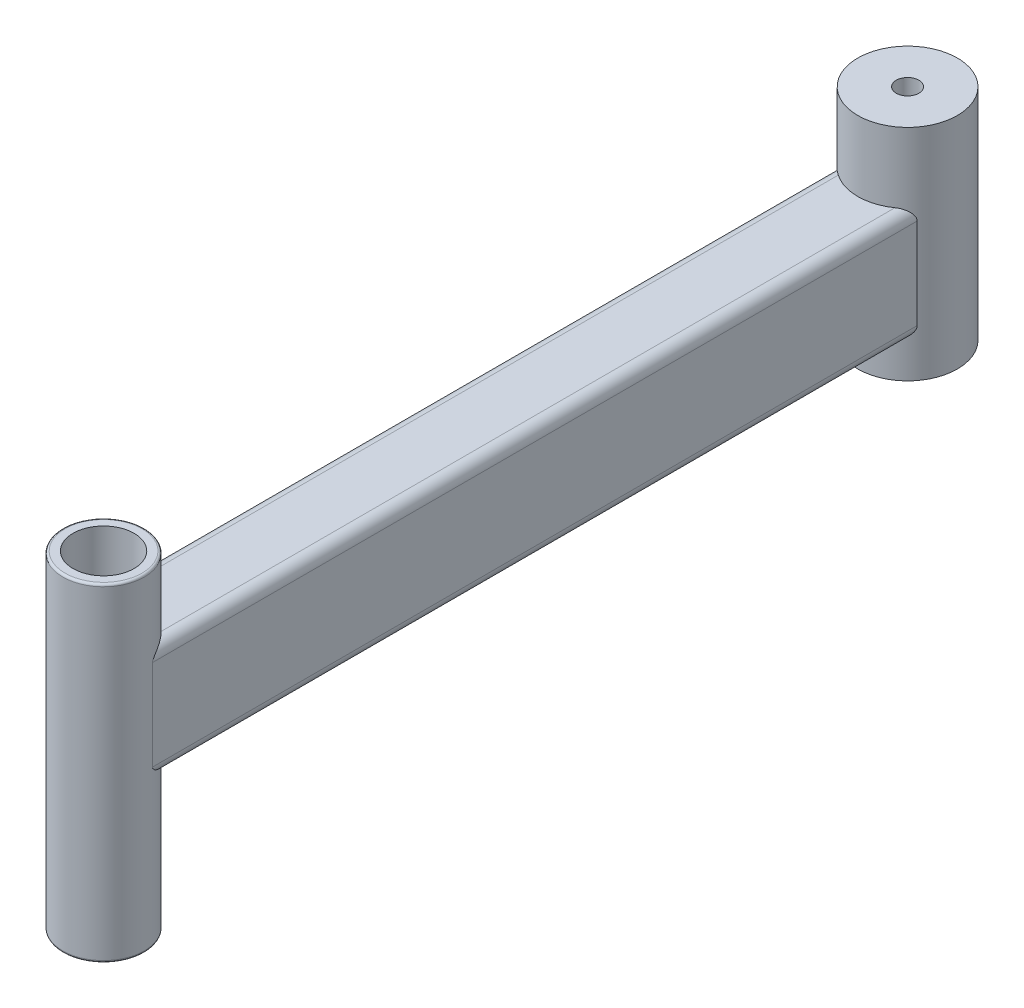
ISO-10303-21;
HEADER;
FILE_DESCRIPTION(('STEP AP214'),'2;1');
FILE_NAME('part.step','',(''),(''),'','','');
FILE_SCHEMA(('AUTOMOTIVE_DESIGN { 1 0 10303 214 1 1 1 1 }'));
ENDSEC;
DATA;
#1=APPLICATION_CONTEXT('core data for automotive mechanical design processes');
#2=APPLICATION_PROTOCOL_DEFINITION('international standard','automotive_design',2000,#1);
#3=PRODUCT_CONTEXT('',#1,'mechanical');
#4=PRODUCT('Part','Part','',(#3));
#5=PRODUCT_RELATED_PRODUCT_CATEGORY('part','',(#4));
#6=PRODUCT_DEFINITION_FORMATION('','',#4);
#7=PRODUCT_DEFINITION_CONTEXT('part definition',#1,'design');
#8=PRODUCT_DEFINITION('design','',#6,#7);
#9=PRODUCT_DEFINITION_SHAPE('','',#8);
#10=(LENGTH_UNIT() NAMED_UNIT(*) SI_UNIT(.MILLI.,.METRE.));
#11=(NAMED_UNIT(*) PLANE_ANGLE_UNIT() SI_UNIT($,.RADIAN.));
#12=(NAMED_UNIT(*) SI_UNIT($,.STERADIAN.) SOLID_ANGLE_UNIT());
#13=UNCERTAINTY_MEASURE_WITH_UNIT(LENGTH_MEASURE(1.E-05),#10,'distance_accuracy_value','');
#14=(GEOMETRIC_REPRESENTATION_CONTEXT(3) GLOBAL_UNCERTAINTY_ASSIGNED_CONTEXT((#13)) GLOBAL_UNIT_ASSIGNED_CONTEXT((#10,
#11,#12)) REPRESENTATION_CONTEXT('',''));
#15=CARTESIAN_POINT('',(0.,0.,0.));
#16=DIRECTION('',(0.,0.,1.));
#17=DIRECTION('',(1.,0.,0.));
#18=AXIS2_PLACEMENT_3D('',#15,#16,#17);
#19=CARTESIAN_POINT('',(0.,-145.,355.176041906346));
#20=DIRECTION('',(0.,1.,0.));
#21=DIRECTION('',(0.,0.,1.));
#22=AXIS2_PLACEMENT_3D('',#19,#20,#21);
#23=CYLINDRICAL_SURFACE('',#22,18.);
#24=CARTESIAN_POINT('',(0.,-144.,355.176041906346));
#25=DIRECTION('',(0.,1.,0.));
#26=DIRECTION('',(0.,0.,1.));
#27=AXIS2_PLACEMENT_3D('',#24,#25,#26);
#28=CIRCLE('',#27,18.);
#29=CARTESIAN_POINT('',(0.,-144.,373.176041906346));
#30=VERTEX_POINT('',#29);
#31=EDGE_CURVE('E55',#30,#30,#28,.T.);
#32=ORIENTED_EDGE('',*,*,#31,.T.);
#33=EDGE_LOOP('',(#32));
#34=FACE_BOUND('',#33,.T.);
#35=CARTESIAN_POINT('',(0.,-1.,355.176041906346));
#36=DIRECTION('',(0.,1.,0.));
#37=DIRECTION('',(0.,0.,1.));
#38=AXIS2_PLACEMENT_3D('',#35,#36,#37);
#39=CIRCLE('',#38,18.);
#40=CARTESIAN_POINT('',(0.,-1.,373.176041906346));
#41=VERTEX_POINT('',#40);
#42=EDGE_CURVE('E59',#41,#41,#39,.F.);
#43=ORIENTED_EDGE('',*,*,#42,.T.);
#44=EDGE_LOOP('',(#43));
#45=FACE_BOUND('',#44,.T.);
#46=ADVANCED_FACE('F44',(#34,#45),#23,.T.);
#47=CARTESIAN_POINT('',(0.,-145.,355.176041906346));
#48=DIRECTION('',(0.,1.,0.));
#49=DIRECTION('',(0.,0.,1.));
#50=AXIS2_PLACEMENT_3D('',#47,#48,#49);
#51=PLANE('',#50);
#52=CARTESIAN_POINT('',(0.,-145.,355.176041906346));
#53=DIRECTION('',(0.,1.,0.));
#54=DIRECTION('',(0.,0.,1.));
#55=AXIS2_PLACEMENT_3D('',#52,#53,#54);
#56=CIRCLE('',#55,17.);
#57=CARTESIAN_POINT('',(0.,-145.,372.176041906346));
#58=VERTEX_POINT('',#57);
#59=EDGE_CURVE('E51',#58,#58,#56,.F.);
#60=ORIENTED_EDGE('',*,*,#59,.T.);
#61=EDGE_LOOP('',(#60));
#62=FACE_BOUND('',#61,.T.);
#63=CARTESIAN_POINT('',(0.,-145.,355.176041906346));
#64=DIRECTION('',(0.,1.,0.));
#65=DIRECTION('',(0.,0.,1.));
#66=AXIS2_PLACEMENT_3D('',#63,#64,#65);
#67=CIRCLE('',#66,13.5);
#68=CARTESIAN_POINT('',(0.,-145.,368.676041906346));
#69=VERTEX_POINT('',#68);
#70=EDGE_CURVE('E64',#69,#69,#67,.T.);
#71=ORIENTED_EDGE('',*,*,#70,.T.);
#72=EDGE_LOOP('',(#71));
#73=FACE_BOUND('',#72,.T.);
#74=ADVANCED_FACE('F71',(#62,#73),#51,.F.);
#75=CARTESIAN_POINT('',(0.,0.,355.176041906346));
#76=DIRECTION('',(0.,1.,0.));
#77=DIRECTION('',(0.,0.,1.));
#78=AXIS2_PLACEMENT_3D('',#75,#76,#77);
#79=PLANE('',#78);
#80=CARTESIAN_POINT('',(0.,0.,355.176041906346));
#81=DIRECTION('',(0.,1.,0.));
#82=DIRECTION('',(0.,0.,1.));
#83=AXIS2_PLACEMENT_3D('',#80,#81,#82);
#84=CIRCLE('',#83,17.);
#85=CARTESIAN_POINT('',(0.,0.,372.176041906346));
#86=VERTEX_POINT('',#85);
#87=EDGE_CURVE('E11',#86,#86,#84,.T.);
#88=ORIENTED_EDGE('',*,*,#87,.T.);
#89=EDGE_LOOP('',(#88));
#90=FACE_BOUND('',#89,.T.);
#91=CARTESIAN_POINT('',(0.,0.,355.176041906346));
#92=DIRECTION('',(0.,1.,0.));
#93=DIRECTION('',(0.,0.,1.));
#94=AXIS2_PLACEMENT_3D('',#91,#92,#93);
#95=CIRCLE('',#94,13.5);
#96=CARTESIAN_POINT('',(0.,0.,368.676041906346));
#97=VERTEX_POINT('',#96);
#98=EDGE_CURVE('E65',#97,#97,#95,.T.);
#99=ORIENTED_EDGE('',*,*,#98,.F.);
#100=EDGE_LOOP('',(#99));
#101=FACE_BOUND('',#100,.T.);
#102=ADVANCED_FACE('F77',(#90,#101),#79,.T.);
#103=CARTESIAN_POINT('',(0.,-145.,355.176041906346));
#104=DIRECTION('',(0.,1.,0.));
#105=DIRECTION('',(0.,0.,1.));
#106=AXIS2_PLACEMENT_3D('',#103,#104,#105);
#107=CYLINDRICAL_SURFACE('',#106,13.5);
#108=ORIENTED_EDGE('',*,*,#70,.F.);
#109=EDGE_LOOP('',(#108));
#110=FACE_BOUND('',#109,.T.);
#111=ORIENTED_EDGE('',*,*,#98,.T.);
#112=EDGE_LOOP('',(#111));
#113=FACE_BOUND('',#112,.T.);
#114=ADVANCED_FACE('F73',(#110,#113),#107,.F.);
#115=CARTESIAN_POINT('',(0.,-144.,355.176041906346));
#116=DIRECTION('',(0.,1.,0.));
#117=DIRECTION('',(0.,0.,1.));
#118=AXIS2_PLACEMENT_3D('',#115,#116,#117);
#119=TOROIDAL_SURFACE('',#118,17.,1.);
#120=ORIENTED_EDGE('',*,*,#59,.F.);
#121=EDGE_LOOP('',(#120));
#122=FACE_BOUND('',#121,.T.);
#123=ORIENTED_EDGE('',*,*,#31,.F.);
#124=EDGE_LOOP('',(#123));
#125=FACE_BOUND('',#124,.T.);
#126=ADVANCED_FACE('F76',(#122,#125),#119,.T.);
#127=CARTESIAN_POINT('',(0.,-1.,355.176041906346));
#128=DIRECTION('',(0.,1.,0.));
#129=DIRECTION('',(0.,0.,1.));
#130=AXIS2_PLACEMENT_3D('',#127,#128,#129);
#131=TOROIDAL_SURFACE('',#130,17.,1.);
#132=ORIENTED_EDGE('',*,*,#42,.F.);
#133=EDGE_LOOP('',(#132));
#134=FACE_BOUND('',#133,.T.);
#135=ORIENTED_EDGE('',*,*,#87,.F.);
#136=EDGE_LOOP('',(#135));
#137=FACE_BOUND('',#136,.T.);
#138=ADVANCED_FACE('F46',(#134,#137),#131,.T.);
#139=CLOSED_SHELL('',(#46,#74,#102,#114,#126,#138));
#140=MANIFOLD_SOLID_BREP('B2',#139);
#141=CARTESIAN_POINT('',(0.,-97.,0.));
#142=DIRECTION('',(0.,1.,0.));
#143=DIRECTION('',(0.,0.,1.));
#144=AXIS2_PLACEMENT_3D('',#141,#142,#143);
#145=CYLINDRICAL_SURFACE('',#144,354.);
#146=DIRECTION('',(0.,1.,0.));
#147=VECTOR('',#146,1.);
#148=CARTESIAN_POINT('',(17.5,-97.,353.56717890664));
#149=LINE('',#148,#147);
#150=CARTESIAN_POINT('',(17.5,-36.,353.56717890664));
#151=VERTEX_POINT('',#150);
#152=CARTESIAN_POINT('',(17.5,-76.,353.56717890664));
#153=VERTEX_POINT('',#152);
#154=EDGE_CURVE('E244',#151,#153,#149,.F.);
#155=ORIENTED_EDGE('',*,*,#154,.F.);
#156=CARTESIAN_POINT('',(17.5,-36.,353.56717890664));
#157=CARTESIAN_POINT('',(17.5000150647416,-35.8595122688849,353.567177530147));
#158=CARTESIAN_POINT('',(17.4940795456842,-35.719027061953,353.567471923026));
#159=CARTESIAN_POINT('',(17.4704167652271,-35.4390624475994,353.568642271233));
#160=CARTESIAN_POINT('',(17.4526900953272,-35.2995829900793,353.569518197389));
#161=CARTESIAN_POINT('',(17.4055637740498,-35.0226713074506,353.571841176537));
#162=CARTESIAN_POINT('',(17.3761687594073,-34.8852382916126,353.573288002665));
#163=CARTESIAN_POINT('',(17.3059232179096,-34.61334312231,353.576733206472));
#164=CARTESIAN_POINT('',(17.2650728215672,-34.4788809350173,353.578731577866));
#165=CARTESIAN_POINT('',(17.172189236064,-34.2138415058942,353.583254802887));
#166=CARTESIAN_POINT('',(17.1201535353781,-34.0832651440877,353.585779774752));
#167=CARTESIAN_POINT('',(17.0052835768178,-33.8269429867388,353.591322896068));
#168=CARTESIAN_POINT('',(16.9424452888188,-33.7011990155167,353.594341229558));
#169=CARTESIAN_POINT('',(16.7384749105206,-33.3328047226124,353.604075278363));
#170=CARTESIAN_POINT('',(16.5817439756881,-33.0985844334664,353.611477118996));
#171=CARTESIAN_POINT('',(16.2311192063511,-32.6596875265278,353.627744085246));
#172=CARTESIAN_POINT('',(16.0372045873971,-32.4550275446746,353.636610028862));
#173=CARTESIAN_POINT('',(15.7228342629522,-32.1746686789475,353.650680121018));
#174=CARTESIAN_POINT('',(15.6140288592515,-32.0855921474136,353.655502953559));
#175=CARTESIAN_POINT('',(15.3893265585896,-31.9169255147087,353.665352071123));
#176=CARTESIAN_POINT('',(15.2734320362899,-31.8373322629485,353.670378287831));
#177=CARTESIAN_POINT('',(15.0225157172517,-31.6801464373086,353.681129601343));
#178=CARTESIAN_POINT('',(14.8867789280421,-31.6036949215522,353.686871619632));
#179=CARTESIAN_POINT('',(14.6087573258985,-31.4637716309417,353.69846420597));
#180=CARTESIAN_POINT('',(14.4664716717237,-31.4003015293603,353.704314787905));
#181=CARTESIAN_POINT('',(14.1763909194352,-31.286828228562,353.716059829899));
#182=CARTESIAN_POINT('',(14.0285881283007,-31.2368446991274,353.721954341298));
#183=CARTESIAN_POINT('',(13.7289698668668,-31.1508780525017,353.733710682413));
#184=CARTESIAN_POINT('',(13.5771545204372,-31.1148945036606,353.73957251313));
#185=CARTESIAN_POINT('',(13.4239792267503,-31.0861153464358,353.745384113659));
#186=B_SPLINE_CURVE_WITH_KNOTS('',3,(#156,#157,#158,#159,#160,#161,#162,#163,#164,#165,#166,
#167,#168,#169,#170,#171,#172,#173,#174,#175,#176,#177,#178,#179,#180,#181,#182,#183,#184,#185),
.UNSPECIFIED.,.F.,.F.,(4,2,2,2,2,2,2,2,2,2,2,2,2,2,4),(0.,0.421333815555317,0.842646496610867,
1.26379192491492,1.68493255524371,2.10616784658078,2.52756063069695,3.36906635436879,
4.21104383034043,4.63272476248174,5.05426520842366,5.52125749475896,5.98830993738756,
6.45603992520483,6.92375549074531),.UNSPECIFIED.);
#187=CARTESIAN_POINT('',(13.4239792267503,-31.0861153464358,353.745384113659));
#188=VERTEX_POINT('',#187);
#189=EDGE_CURVE('E42',#151,#188,#186,.T.);
#190=ORIENTED_EDGE('',*,*,#189,.T.);
#191=DIRECTION('',(0.,1.,0.));
#192=VECTOR('',#191,1.);
#193=CARTESIAN_POINT('',(13.4239792267503,-72.5,353.745384113659));
#194=LINE('',#193,#192);
#195=CARTESIAN_POINT('',(13.4239792267503,-80.9138846535642,353.745384113659));
#196=VERTEX_POINT('',#195);
#197=EDGE_CURVE('E251',#196,#188,#194,.T.);
#198=ORIENTED_EDGE('',*,*,#197,.F.);
#199=CARTESIAN_POINT('',(13.4239792267503,-80.9138846535642,353.745384113659));
#200=CARTESIAN_POINT('',(13.5622448105588,-80.8879011262021,353.740137939004));
#201=CARTESIAN_POINT('',(13.6994038018701,-80.8560541415393,353.734851102303));
#202=CARTESIAN_POINT('',(13.9705456604678,-80.7809251503498,353.724245875584));
#203=CARTESIAN_POINT('',(14.1045286747848,-80.7376436743094,353.71892748704));
#204=CARTESIAN_POINT('',(14.3683248410708,-80.6399513507016,353.708310194541));
#205=CARTESIAN_POINT('',(14.4981393628623,-80.5855442033929,353.703011284704));
#206=CARTESIAN_POINT('',(14.7527207854878,-80.465985391055,353.692484304986));
#207=CARTESIAN_POINT('',(14.8774877469497,-80.400833855128,353.687256234256));
#208=CARTESIAN_POINT('',(15.1211264358502,-80.2602201366558,353.676923765772));
#209=CARTESIAN_POINT('',(15.239996723478,-80.1847554526404,353.671819398379));
#210=CARTESIAN_POINT('',(15.4709777639643,-80.024067265977,353.661790750362));
#211=CARTESIAN_POINT('',(15.5830859724721,-79.9388401245714,353.656866537796));
#212=CARTESIAN_POINT('',(15.9078343101979,-79.6695447424325,353.642457319038));
#213=CARTESIAN_POINT('',(16.1092766928675,-79.4716435601888,353.633319550023));
#214=CARTESIAN_POINT('',(16.4759510296092,-79.044821770797,353.616426249946));
#215=CARTESIAN_POINT('',(16.6411969743694,-78.8159132042229,353.608670185045));
#216=CARTESIAN_POINT('',(16.8584634340692,-78.45431773029,353.598356115957));
#217=CARTESIAN_POINT('',(16.9258272935594,-78.3306395847124,353.595136026434));
#218=CARTESIAN_POINT('',(17.0498871219571,-78.0780507819592,353.589175755122));
#219=CARTESIAN_POINT('',(17.1065866876546,-77.9491419068709,353.58643541155));
#220=CARTESIAN_POINT('',(17.2140799694899,-77.6737541248984,353.581219298932));
#221=CARTESIAN_POINT('',(17.2636996415416,-77.5268152351301,353.578798166617));
#222=CARTESIAN_POINT('',(17.3490941796084,-77.2289414582683,353.57461835904));
#223=CARTESIAN_POINT('',(17.384867377981,-77.0780060921844,353.572859763573));
#224=CARTESIAN_POINT('',(17.4422842721889,-76.7732341539829,353.5700320964));
#225=CARTESIAN_POINT('',(17.4639070637159,-76.6193936334734,353.568964044858));
#226=CARTESIAN_POINT('',(17.4927761113495,-76.3103698574379,353.567536428363));
#227=CARTESIAN_POINT('',(17.5000226445089,-76.1551866278459,353.567176849756));
#228=CARTESIAN_POINT('',(17.5,-76.,353.56717890664));
#229=B_SPLINE_CURVE_WITH_KNOTS('',3,(#199,#200,#201,#202,#203,#204,#205,#206,#207,#208,#209,
#210,#211,#212,#213,#214,#215,#216,#217,#218,#219,#220,#221,#222,#223,#224,#225,#226,#227,#228),
.UNSPECIFIED.,.F.,.F.,(4,2,2,2,2,2,2,2,2,2,2,2,2,2,4),(0.,0.422221545968484,0.844423507030667,
1.2664852767316,1.68854197540075,2.11070122687264,2.53301834480092,3.37635645697449,
4.21936802369179,4.6415580738682,5.0636054739225,5.52825926010098,5.99296899088226,
6.45836369394406,6.9237494280415),.UNSPECIFIED.);
#230=EDGE_CURVE('E156',#196,#153,#229,.T.);
#231=ORIENTED_EDGE('',*,*,#230,.T.);
#232=EDGE_LOOP('',(#155,#190,#198,#231));
#233=FACE_BOUND('',#232,.T.);
#234=ADVANCED_FACE('F143',(#233),#145,.T.);
#235=CARTESIAN_POINT('',(-17.5,-31.,12.));
#236=DIRECTION('',(0.,-1.,0.));
#237=DIRECTION('',(1.,0.,0.));
#238=AXIS2_PLACEMENT_3D('',#235,#236,#237);
#239=PLANE('',#238);
#240=DIRECTION('',(1.,0.,0.));
#241=VECTOR('',#240,1.);
#242=CARTESIAN_POINT('',(-17.5,-31.,12.));
#243=LINE('',#242,#241);
#244=CARTESIAN_POINT('',(-12.5,-31.,12.));
#245=VERTEX_POINT('',#244);
#246=CARTESIAN_POINT('',(12.5,-31.,12.));
#247=VERTEX_POINT('',#246);
#248=EDGE_CURVE('E346',#245,#247,#243,.T.);
#249=ORIENTED_EDGE('',*,*,#248,.F.);
#250=DIRECTION('',(0.,0.,1.));
#251=VECTOR('',#250,1.);
#252=CARTESIAN_POINT('',(-12.5,-31.,353.56717890664));
#253=LINE('',#252,#251);
#254=CARTESIAN_POINT('',(-12.5,-31.,350.077022392753));
#255=VERTEX_POINT('',#254);
#256=EDGE_CURVE('E330',#245,#255,#253,.T.);
#257=ORIENTED_EDGE('',*,*,#256,.T.);
#258=CARTESIAN_POINT('',(0.,-31.,355.176041906346));
#259=DIRECTION('',(0.,-1.,0.));
#260=DIRECTION('',(1.,0.,0.));
#261=AXIS2_PLACEMENT_3D('',#258,#259,#260);
#262=CIRCLE('',#261,13.5);
#263=CARTESIAN_POINT('',(12.5,-31.,350.077022392753));
#264=VERTEX_POINT('',#263);
#265=EDGE_CURVE('E245',#255,#264,#262,.T.);
#266=ORIENTED_EDGE('',*,*,#265,.T.);
#267=DIRECTION('',(0.,0.,1.));
#268=VECTOR('',#267,1.);
#269=CARTESIAN_POINT('',(12.5,-31.,12.));
#270=LINE('',#269,#268);
#271=EDGE_CURVE('E328',#264,#247,#270,.F.);
#272=ORIENTED_EDGE('',*,*,#271,.T.);
#273=EDGE_LOOP('',(#249,#257,#266,#272));
#274=FACE_BOUND('',#273,.T.);
#275=ADVANCED_FACE('F366',(#274),#239,.F.);
#276=CARTESIAN_POINT('',(17.5,-31.,12.));
#277=DIRECTION('',(-1.,0.,0.));
#278=DIRECTION('',(0.,-1.,0.));
#279=AXIS2_PLACEMENT_3D('',#276,#277,#278);
#280=PLANE('',#279);
#281=DIRECTION('',(0.,-1.,0.));
#282=VECTOR('',#281,1.);
#283=CARTESIAN_POINT('',(17.5,-31.,12.));
#284=LINE('',#283,#282);
#285=CARTESIAN_POINT('',(17.5,-36.,12.));
#286=VERTEX_POINT('',#285);
#287=CARTESIAN_POINT('',(17.5,-76.,12.));
#288=VERTEX_POINT('',#287);
#289=EDGE_CURVE('E344',#286,#288,#284,.T.);
#290=ORIENTED_EDGE('',*,*,#289,.F.);
#291=DIRECTION('',(0.,0.,1.));
#292=VECTOR('',#291,1.);
#293=CARTESIAN_POINT('',(17.5,-36.,12.));
#294=LINE('',#293,#292);
#295=EDGE_CURVE('E335',#286,#151,#294,.T.);
#296=ORIENTED_EDGE('',*,*,#295,.T.);
#297=ORIENTED_EDGE('',*,*,#154,.T.);
#298=DIRECTION('',(0.,0.,1.));
#299=VECTOR('',#298,1.);
#300=CARTESIAN_POINT('',(17.5,-76.,12.));
#301=LINE('',#300,#299);
#302=EDGE_CURVE('E333',#153,#288,#301,.F.);
#303=ORIENTED_EDGE('',*,*,#302,.T.);
#304=EDGE_LOOP('',(#290,#296,#297,#303));
#305=FACE_BOUND('',#304,.T.);
#306=ADVANCED_FACE('F341',(#305),#280,.F.);
#307=CARTESIAN_POINT('',(-17.5,-81.,12.));
#308=DIRECTION('',(0.,-1.,0.));
#309=DIRECTION('',(0.,0.,-1.));
#310=AXIS2_PLACEMENT_3D('',#307,#308,#309);
#311=PLANE('',#310);
#312=CARTESIAN_POINT('',(0.,-81.,355.176041906346));
#313=DIRECTION('',(0.,-1.,0.));
#314=DIRECTION('',(0.,0.,-1.));
#315=AXIS2_PLACEMENT_3D('',#312,#313,#314);
#316=CIRCLE('',#315,13.5);
#317=CARTESIAN_POINT('',(-12.5,-81.,350.077022392753));
#318=VERTEX_POINT('',#317);
#319=CARTESIAN_POINT('',(12.5,-81.,350.077022392753));
#320=VERTEX_POINT('',#319);
#321=EDGE_CURVE('E367',#318,#320,#316,.T.);
#322=ORIENTED_EDGE('',*,*,#321,.F.);
#323=DIRECTION('',(0.,0.,1.));
#324=VECTOR('',#323,1.);
#325=CARTESIAN_POINT('',(-12.5,-81.,12.));
#326=LINE('',#325,#324);
#327=CARTESIAN_POINT('',(-12.5,-81.,12.));
#328=VERTEX_POINT('',#327);
#329=EDGE_CURVE('E313',#318,#328,#326,.F.);
#330=ORIENTED_EDGE('',*,*,#329,.T.);
#331=DIRECTION('',(1.,0.,0.));
#332=VECTOR('',#331,1.);
#333=CARTESIAN_POINT('',(-17.5,-81.,12.));
#334=LINE('',#333,#332);
#335=CARTESIAN_POINT('',(12.5,-81.,12.));
#336=VERTEX_POINT('',#335);
#337=EDGE_CURVE('E354',#328,#336,#334,.T.);
#338=ORIENTED_EDGE('',*,*,#337,.T.);
#339=DIRECTION('',(0.,0.,1.));
#340=VECTOR('',#339,1.);
#341=CARTESIAN_POINT('',(12.5,-81.,353.56717890664));
#342=LINE('',#341,#340);
#343=EDGE_CURVE('E314',#336,#320,#342,.T.);
#344=ORIENTED_EDGE('',*,*,#343,.T.);
#345=EDGE_LOOP('',(#322,#330,#338,#344));
#346=FACE_BOUND('',#345,.T.);
#347=ADVANCED_FACE('F360',(#346),#311,.T.);
#348=CARTESIAN_POINT('',(-17.5,-31.,12.));
#349=DIRECTION('',(-1.,0.,0.));
#350=DIRECTION('',(0.,-1.,0.));
#351=AXIS2_PLACEMENT_3D('',#348,#349,#350);
#352=PLANE('',#351);
#353=DIRECTION('',(0.,-1.,0.));
#354=VECTOR('',#353,1.);
#355=CARTESIAN_POINT('',(-17.5,-31.,12.));
#356=LINE('',#355,#354);
#357=CARTESIAN_POINT('',(-17.5,-36.,12.));
#358=VERTEX_POINT('',#357);
#359=CARTESIAN_POINT('',(-17.5,-76.,12.));
#360=VERTEX_POINT('',#359);
#361=EDGE_CURVE('E310',#358,#360,#356,.T.);
#362=ORIENTED_EDGE('',*,*,#361,.T.);
#363=DIRECTION('',(0.,0.,1.));
#364=VECTOR('',#363,1.);
#365=CARTESIAN_POINT('',(-17.5,-76.,12.));
#366=LINE('',#365,#364);
#367=CARTESIAN_POINT('',(-17.5,-76.,353.56717890664));
#368=VERTEX_POINT('',#367);
#369=EDGE_CURVE('E235',#360,#368,#366,.T.);
#370=ORIENTED_EDGE('',*,*,#369,.T.);
#371=DIRECTION('',(0.,1.,0.));
#372=VECTOR('',#371,1.);
#373=CARTESIAN_POINT('',(-17.5,-97.,353.56717890664));
#374=LINE('',#373,#372);
#375=CARTESIAN_POINT('',(-17.5,-36.,353.56717890664));
#376=VERTEX_POINT('',#375);
#377=EDGE_CURVE('E229',#376,#368,#374,.F.);
#378=ORIENTED_EDGE('',*,*,#377,.F.);
#379=DIRECTION('',(0.,0.,1.));
#380=VECTOR('',#379,1.);
#381=CARTESIAN_POINT('',(-17.5,-36.,12.));
#382=LINE('',#381,#380);
#383=EDGE_CURVE('E241',#376,#358,#382,.F.);
#384=ORIENTED_EDGE('',*,*,#383,.T.);
#385=EDGE_LOOP('',(#362,#370,#378,#384));
#386=FACE_BOUND('',#385,.T.);
#387=ADVANCED_FACE('F240',(#386),#352,.T.);
#388=CARTESIAN_POINT('',(0.,0.,12.));
#389=DIRECTION('',(0.,0.,-1.));
#390=DIRECTION('',(-1.,0.,0.));
#391=AXIS2_PLACEMENT_3D('',#388,#389,#390);
#392=PLANE('',#391);
#393=ORIENTED_EDGE('',*,*,#337,.F.);
#394=CARTESIAN_POINT('',(-12.5,-76.,12.));
#395=DIRECTION('',(0.,0.,-1.));
#396=DIRECTION('',(-1.,0.,0.));
#397=AXIS2_PLACEMENT_3D('',#394,#395,#396);
#398=CIRCLE('',#397,5.);
#399=EDGE_CURVE('E326',#328,#360,#398,.T.);
#400=ORIENTED_EDGE('',*,*,#399,.T.);
#401=ORIENTED_EDGE('',*,*,#361,.F.);
#402=CARTESIAN_POINT('',(-12.5,-36.,12.));
#403=DIRECTION('',(0.,0.,-1.));
#404=DIRECTION('',(-1.,0.,0.));
#405=AXIS2_PLACEMENT_3D('',#402,#403,#404);
#406=CIRCLE('',#405,5.);
#407=EDGE_CURVE('E250',#358,#245,#406,.T.);
#408=ORIENTED_EDGE('',*,*,#407,.T.);
#409=ORIENTED_EDGE('',*,*,#248,.T.);
#410=CARTESIAN_POINT('',(12.5,-36.,12.));
#411=DIRECTION('',(0.,0.,-1.));
#412=DIRECTION('',(-1.,0.,0.));
#413=AXIS2_PLACEMENT_3D('',#410,#411,#412);
#414=CIRCLE('',#413,5.);
#415=EDGE_CURVE('E323',#247,#286,#414,.T.);
#416=ORIENTED_EDGE('',*,*,#415,.T.);
#417=ORIENTED_EDGE('',*,*,#289,.T.);
#418=CARTESIAN_POINT('',(12.5,-76.,12.));
#419=DIRECTION('',(0.,0.,-1.));
#420=DIRECTION('',(-1.,0.,0.));
#421=AXIS2_PLACEMENT_3D('',#418,#419,#420);
#422=CIRCLE('',#421,5.);
#423=EDGE_CURVE('E319',#288,#336,#422,.T.);
#424=ORIENTED_EDGE('',*,*,#423,.T.);
#425=EDGE_LOOP('',(#393,#400,#401,#408,#409,#416,#417,#424));
#426=FACE_BOUND('',#425,.T.);
#427=ADVANCED_FACE('F358',(#426),#392,.T.);
#428=ORIENTED_EDGE('',*,*,#377,.T.);
#429=CARTESIAN_POINT('',(-17.5,-76.,353.56717890664));
#430=CARTESIAN_POINT('',(-17.5000150647416,-76.1404877311151,353.567177530147));
#431=CARTESIAN_POINT('',(-17.4940795456842,-76.280972938047,353.567471923026));
#432=CARTESIAN_POINT('',(-17.4704167652271,-76.5609375524006,353.568642271233));
#433=CARTESIAN_POINT('',(-17.4526900953272,-76.7004170099207,353.569518197389));
#434=CARTESIAN_POINT('',(-17.4055637740498,-76.9773286925493,353.571841176537));
#435=CARTESIAN_POINT('',(-17.3761687594073,-77.1147617083874,353.573288002665));
#436=CARTESIAN_POINT('',(-17.3059232179096,-77.38665687769,353.576733206472));
#437=CARTESIAN_POINT('',(-17.2650728215672,-77.5211190649827,353.578731577866));
#438=CARTESIAN_POINT('',(-17.172189236064,-77.7861584941058,353.583254802887));
#439=CARTESIAN_POINT('',(-17.1201535353781,-77.9167348559123,353.585779774752));
#440=CARTESIAN_POINT('',(-17.0052835768178,-78.1730570132612,353.591322896068));
#441=CARTESIAN_POINT('',(-16.9424452888188,-78.2988009844833,353.594341229558));
#442=CARTESIAN_POINT('',(-16.7384749105206,-78.6671952773876,353.604075278363));
#443=CARTESIAN_POINT('',(-16.5817439756881,-78.9014155665336,353.611477118996));
#444=CARTESIAN_POINT('',(-16.2311192063511,-79.3403124734722,353.627744085246));
#445=CARTESIAN_POINT('',(-16.0372045873971,-79.5449724553254,353.636610028862));
#446=CARTESIAN_POINT('',(-15.7228342629522,-79.8253313210525,353.650680121018));
#447=CARTESIAN_POINT('',(-15.6140288592515,-79.9144078525864,353.655502953559));
#448=CARTESIAN_POINT('',(-15.3893265585896,-80.0830744852913,353.665352071123));
#449=CARTESIAN_POINT('',(-15.2734320362899,-80.1626677370515,353.670378287831));
#450=CARTESIAN_POINT('',(-15.0225157172517,-80.3198535626914,353.681129601343));
#451=CARTESIAN_POINT('',(-14.8867789280421,-80.3963050784478,353.686871619632));
#452=CARTESIAN_POINT('',(-14.6087573258985,-80.5362283690583,353.69846420597));
#453=CARTESIAN_POINT('',(-14.4664716717237,-80.5996984706397,353.704314787905));
#454=CARTESIAN_POINT('',(-14.1763909194352,-80.713171771438,353.716059829899));
#455=CARTESIAN_POINT('',(-14.0285881283007,-80.7631553008726,353.721954341298));
#456=CARTESIAN_POINT('',(-13.7289698668668,-80.8491219474983,353.733710682413));
#457=CARTESIAN_POINT('',(-13.5771545204372,-80.8851054963394,353.73957251313));
#458=CARTESIAN_POINT('',(-13.4239792267503,-80.9138846535642,353.745384113659));
#459=B_SPLINE_CURVE_WITH_KNOTS('',3,(#429,#430,#431,#432,#433,#434,#435,#436,#437,#438,#439,
#440,#441,#442,#443,#444,#445,#446,#447,#448,#449,#450,#451,#452,#453,#454,#455,#456,#457,#458),
.UNSPECIFIED.,.F.,.F.,(4,2,2,2,2,2,2,2,2,2,2,2,2,2,4),(0.,0.421333815555331,0.842646496610867,
1.26379192491491,1.68493255524371,2.10616784658077,2.52756063069694,3.3690663543688,
4.21104383034043,4.63272476248174,5.05426520842366,5.52125749475896,5.98830993738756,
6.45603992520482,6.92375549074529),.UNSPECIFIED.);
#460=CARTESIAN_POINT('',(-13.4239792267503,-80.9138846535642,353.745384113659));
#461=VERTEX_POINT('',#460);
#462=EDGE_CURVE('E234',#368,#461,#459,.T.);
#463=ORIENTED_EDGE('',*,*,#462,.T.);
#464=DIRECTION('',(0.,1.,0.));
#465=VECTOR('',#464,1.);
#466=CARTESIAN_POINT('',(-13.4239792267503,-72.5,353.745384113659));
#467=LINE('',#466,#465);
#468=CARTESIAN_POINT('',(-13.4239792267503,-31.0861153464358,353.745384113659));
#469=VERTEX_POINT('',#468);
#470=EDGE_CURVE('E231',#469,#461,#467,.F.);
#471=ORIENTED_EDGE('',*,*,#470,.F.);
#472=CARTESIAN_POINT('',(-13.4239792267503,-31.0861153464358,353.745384113659));
#473=CARTESIAN_POINT('',(-13.5622448105588,-31.1120988737979,353.740137939004));
#474=CARTESIAN_POINT('',(-13.6994038018701,-31.1439458584607,353.734851102303));
#475=CARTESIAN_POINT('',(-13.9705456604678,-31.2190748496502,353.724245875584));
#476=CARTESIAN_POINT('',(-14.1045286747848,-31.2623563256906,353.71892748704));
#477=CARTESIAN_POINT('',(-14.3683248410708,-31.3600486492984,353.708310194541));
#478=CARTESIAN_POINT('',(-14.4981393628623,-31.4144557966071,353.703011284704));
#479=CARTESIAN_POINT('',(-14.7527207854878,-31.534014608945,353.692484304986));
#480=CARTESIAN_POINT('',(-14.8774877469497,-31.599166144872,353.687256234256));
#481=CARTESIAN_POINT('',(-15.1211264358502,-31.7397798633442,353.676923765772));
#482=CARTESIAN_POINT('',(-15.239996723478,-31.8152445473596,353.671819398379));
#483=CARTESIAN_POINT('',(-15.4709777639643,-31.9759327340231,353.661790750362));
#484=CARTESIAN_POINT('',(-15.5830859724721,-32.0611598754286,353.656866537796));
#485=CARTESIAN_POINT('',(-15.9078343101979,-32.3304552575675,353.642457319038));
#486=CARTESIAN_POINT('',(-16.1092766928675,-32.5283564398112,353.633319550023));
#487=CARTESIAN_POINT('',(-16.4759510296092,-32.955178229203,353.616426249946));
#488=CARTESIAN_POINT('',(-16.6411969743694,-33.1840867957771,353.608670185045));
#489=CARTESIAN_POINT('',(-16.8584634340692,-33.54568226971,353.598356115957));
#490=CARTESIAN_POINT('',(-16.9258272935594,-33.6693604152875,353.595136026434));
#491=CARTESIAN_POINT('',(-17.049887121957,-33.9219492180408,353.589175755122));
#492=CARTESIAN_POINT('',(-17.1065866876546,-34.0508580931291,353.58643541155));
#493=CARTESIAN_POINT('',(-17.2140799694899,-34.3262458751016,353.581219298932));
#494=CARTESIAN_POINT('',(-17.2636996415416,-34.4731847648699,353.578798166617));
#495=CARTESIAN_POINT('',(-17.3490941796084,-34.7710585417317,353.57461835904));
#496=CARTESIAN_POINT('',(-17.384867377981,-34.9219939078156,353.572859763573));
#497=CARTESIAN_POINT('',(-17.4422842721889,-35.2267658460172,353.5700320964));
#498=CARTESIAN_POINT('',(-17.4639070637158,-35.3806063665266,353.568964044858));
#499=CARTESIAN_POINT('',(-17.4927761113495,-35.6896301425621,353.567536428363));
#500=CARTESIAN_POINT('',(-17.5000226445089,-35.8448133721541,353.567176849756));
#501=CARTESIAN_POINT('',(-17.5,-36.,353.56717890664));
#502=B_SPLINE_CURVE_WITH_KNOTS('',3,(#472,#473,#474,#475,#476,#477,#478,#479,#480,#481,#482,
#483,#484,#485,#486,#487,#488,#489,#490,#491,#492,#493,#494,#495,#496,#497,#498,#499,#500,#501),
.UNSPECIFIED.,.F.,.F.,(4,2,2,2,2,2,2,2,2,2,2,2,2,2,4),(0.,0.422221545968482,0.84442350703067,
1.2664852767316,1.68854197540075,2.11070122687263,2.53301834480092,3.37635645697449,
4.21936802369176,4.64155807386818,5.06360547392248,5.52825926010097,5.99296899088226,
6.45836369394405,6.9237494280415),.UNSPECIFIED.);
#503=EDGE_CURVE('E226',#469,#376,#502,.T.);
#504=ORIENTED_EDGE('',*,*,#503,.T.);
#505=EDGE_LOOP('',(#428,#463,#471,#504));
#506=FACE_BOUND('',#505,.T.);
#507=ADVANCED_FACE('F228',(#506),#145,.T.);
#508=CARTESIAN_POINT('',(0.,-145.,355.176041906346));
#509=DIRECTION('',(0.,1.,0.));
#510=DIRECTION('',(0.,0.,1.));
#511=AXIS2_PLACEMENT_3D('',#508,#509,#510);
#512=CYLINDRICAL_SURFACE('',#511,13.5);
#513=ORIENTED_EDGE('',*,*,#470,.T.);
#514=CARTESIAN_POINT('',(-13.4239792267503,-80.9138846535642,353.745384113659));
#515=CARTESIAN_POINT('',(-13.4071763038213,-80.9170368281776,353.58771969198));
#516=CARTESIAN_POINT('',(-13.3875976301796,-80.9206372317102,353.430373275264));
#517=CARTESIAN_POINT('',(-13.3429143594401,-80.9284910674924,353.116486657976));
#518=CARTESIAN_POINT('',(-13.3178098799026,-80.9327444858486,352.959946440325));
#519=CARTESIAN_POINT('',(-13.2345281249897,-80.9460740329486,352.493367376093));
#520=CARTESIAN_POINT('',(-13.1682108598333,-80.9557564803299,352.184763406921));
#521=CARTESIAN_POINT('',(-13.0141101218389,-80.9741033926083,351.572923692448));
#522=CARTESIAN_POINT('',(-12.9263264842243,-80.9827678496906,351.269687988372));
#523=CARTESIAN_POINT('',(-12.7786304988714,-80.9924746307987,350.819236745524));
#524=CARTESIAN_POINT('',(-12.726575857086,-80.9951645145901,350.669445757948));
#525=CARTESIAN_POINT('',(-12.6172128729213,-80.9989242036455,350.371764153284));
#526=CARTESIAN_POINT('',(-12.5599042131452,-80.9999939109658,350.22387365162));
#527=CARTESIAN_POINT('',(-12.5,-81.,350.077022392753));
#528=B_SPLINE_CURVE_WITH_KNOTS('',3,(#514,#515,#516,#517,#518,#519,#520,#521,#522,#523,#524,
#525,#526,#527),.UNSPECIFIED.,.F.,.F.,(4,2,2,2,2,2,4),(0.,0.475715031297785,0.95141994285667,
1.89799198352207,2.84457129033658,3.32028033763883,3.79601814162236),.UNSPECIFIED.);
#529=EDGE_CURVE('E285',#461,#318,#528,.T.);
#530=ORIENTED_EDGE('',*,*,#529,.T.);
#531=ORIENTED_EDGE('',*,*,#321,.T.);
#532=CARTESIAN_POINT('',(12.5,-81.,350.077022392753));
#533=CARTESIAN_POINT('',(12.5599042131452,-80.9999939109658,350.22387365162));
#534=CARTESIAN_POINT('',(12.6172128729213,-80.9989242036455,350.371764153284));
#535=CARTESIAN_POINT('',(12.7265758570861,-80.9951645145901,350.669445757948));
#536=CARTESIAN_POINT('',(12.7786304988714,-80.9924746307987,350.819236745524));
#537=CARTESIAN_POINT('',(12.9263264842243,-80.9827678496906,351.269687988372));
#538=CARTESIAN_POINT('',(13.0141101218389,-80.9741033926083,351.572923692448));
#539=CARTESIAN_POINT('',(13.1682108598333,-80.9557564803299,352.184763406921));
#540=CARTESIAN_POINT('',(13.2345281249897,-80.9460740329486,352.493367376093));
#541=CARTESIAN_POINT('',(13.3178098799026,-80.9327444858486,352.959946440325));
#542=CARTESIAN_POINT('',(13.3429143594401,-80.9284910674924,353.116486657976));
#543=CARTESIAN_POINT('',(13.3875976301796,-80.9206372317102,353.430373275264));
#544=CARTESIAN_POINT('',(13.4071763038213,-80.9170368281776,353.58771969198));
#545=CARTESIAN_POINT('',(13.4239792267503,-80.9138846535642,353.745384113659));
#546=B_SPLINE_CURVE_WITH_KNOTS('',3,(#532,#533,#534,#535,#536,#537,#538,#539,#540,#541,#542,
#543,#544,#545),.UNSPECIFIED.,.F.,.F.,(4,2,2,2,2,2,4),(0.,0.475737803983525,0.951446851285829,
1.89802615810029,2.84459819876568,3.32030311032451,3.7960181416223),.UNSPECIFIED.);
#547=EDGE_CURVE('E300',#320,#196,#546,.T.);
#548=ORIENTED_EDGE('',*,*,#547,.T.);
#549=ORIENTED_EDGE('',*,*,#197,.T.);
#550=CARTESIAN_POINT('',(13.4239792267503,-31.0861153464358,353.745384113659));
#551=CARTESIAN_POINT('',(13.4071763038213,-31.0829631718224,353.58771969198));
#552=CARTESIAN_POINT('',(13.3875976301796,-31.0793627682898,353.430373275264));
#553=CARTESIAN_POINT('',(13.3429143594401,-31.0715089325076,353.116486657976));
#554=CARTESIAN_POINT('',(13.3178098799026,-31.0672555141514,352.959946440325));
#555=CARTESIAN_POINT('',(13.2345281249897,-31.0539259670514,352.493367376093));
#556=CARTESIAN_POINT('',(13.1682108598333,-31.0442435196701,352.184763406921));
#557=CARTESIAN_POINT('',(13.0141101218389,-31.0258966073917,351.572923692448));
#558=CARTESIAN_POINT('',(12.9263264842243,-31.0172321503094,351.269687988372));
#559=CARTESIAN_POINT('',(12.7786304988714,-31.0075253692013,350.819236745524));
#560=CARTESIAN_POINT('',(12.7265758570861,-31.0048354854099,350.669445757948));
#561=CARTESIAN_POINT('',(12.6172128729213,-31.0010757963545,350.371764153284));
#562=CARTESIAN_POINT('',(12.5599042131452,-31.0000060890342,350.22387365162));
#563=CARTESIAN_POINT('',(12.5,-31.,350.077022392753));
#564=B_SPLINE_CURVE_WITH_KNOTS('',3,(#550,#551,#552,#553,#554,#555,#556,#557,#558,#559,#560,
#561,#562,#563),.UNSPECIFIED.,.F.,.F.,(4,2,2,2,2,2,4),(0.,0.475715031297785,0.951419942856613,
1.89799198352201,2.84457129033653,3.32028033763883,3.7960181416223),.UNSPECIFIED.);
#565=EDGE_CURVE('E286',#188,#264,#564,.T.);
#566=ORIENTED_EDGE('',*,*,#565,.T.);
#567=ORIENTED_EDGE('',*,*,#265,.F.);
#568=CARTESIAN_POINT('',(-12.5,-31.,350.077022392753));
#569=CARTESIAN_POINT('',(-12.5599042131452,-31.0000060890342,350.22387365162));
#570=CARTESIAN_POINT('',(-12.6172128729213,-31.0010757963545,350.371764153284));
#571=CARTESIAN_POINT('',(-12.7265758570861,-31.0048354854099,350.669445757948));
#572=CARTESIAN_POINT('',(-12.7786304988714,-31.0075253692013,350.819236745524));
#573=CARTESIAN_POINT('',(-12.9263264842243,-31.0172321503094,351.269687988372));
#574=CARTESIAN_POINT('',(-13.0141101218389,-31.0258966073917,351.572923692448));
#575=CARTESIAN_POINT('',(-13.1682108598333,-31.0442435196701,352.184763406921));
#576=CARTESIAN_POINT('',(-13.2345281249897,-31.0539259670514,352.493367376093));
#577=CARTESIAN_POINT('',(-13.3178098799026,-31.0672555141514,352.959946440325));
#578=CARTESIAN_POINT('',(-13.3429143594401,-31.0715089325076,353.116486657976));
#579=CARTESIAN_POINT('',(-13.3875976301796,-31.0793627682898,353.430373275264));
#580=CARTESIAN_POINT('',(-13.4071763038213,-31.0829631718224,353.58771969198));
#581=CARTESIAN_POINT('',(-13.4239792267503,-31.0861153464358,353.745384113659));
#582=B_SPLINE_CURVE_WITH_KNOTS('',3,(#568,#569,#570,#571,#572,#573,#574,#575,#576,#577,#578,
#579,#580,#581),.UNSPECIFIED.,.F.,.F.,(4,2,2,2,2,2,4),(0.,0.475737803983523,0.951446851285827,
1.89802615810034,2.84459819876574,3.32030311032457,3.79601814162235),.UNSPECIFIED.);
#583=EDGE_CURVE('E279',#255,#469,#582,.T.);
#584=ORIENTED_EDGE('',*,*,#583,.T.);
#585=EDGE_LOOP('',(#513,#530,#531,#548,#549,#566,#567,#584));
#586=FACE_BOUND('',#585,.T.);
#587=ADVANCED_FACE('F294',(#586),#512,.F.);
#588=CARTESIAN_POINT('',(-12.5,-76.,12.));
#589=DIRECTION('',(0.,0.,1.));
#590=DIRECTION('',(1.,0.,0.));
#591=AXIS2_PLACEMENT_3D('',#588,#589,#590);
#592=CYLINDRICAL_SURFACE('',#591,5.);
#593=ORIENTED_EDGE('',*,*,#399,.F.);
#594=ORIENTED_EDGE('',*,*,#329,.F.);
#595=ORIENTED_EDGE('',*,*,#529,.F.);
#596=ORIENTED_EDGE('',*,*,#462,.F.);
#597=ORIENTED_EDGE('',*,*,#369,.F.);
#598=EDGE_LOOP('',(#593,#594,#595,#596,#597));
#599=FACE_BOUND('',#598,.T.);
#600=ADVANCED_FACE('F273',(#599),#592,.T.);
#601=CARTESIAN_POINT('',(-12.5,-36.,12.));
#602=DIRECTION('',(0.,0.,-1.));
#603=DIRECTION('',(-1.,0.,0.));
#604=AXIS2_PLACEMENT_3D('',#601,#602,#603);
#605=CYLINDRICAL_SURFACE('',#604,5.);
#606=ORIENTED_EDGE('',*,*,#407,.F.);
#607=ORIENTED_EDGE('',*,*,#383,.F.);
#608=ORIENTED_EDGE('',*,*,#503,.F.);
#609=ORIENTED_EDGE('',*,*,#583,.F.);
#610=ORIENTED_EDGE('',*,*,#256,.F.);
#611=EDGE_LOOP('',(#606,#607,#608,#609,#610));
#612=FACE_BOUND('',#611,.T.);
#613=ADVANCED_FACE('F248',(#612),#605,.T.);
#614=CARTESIAN_POINT('',(12.5,-36.,12.));
#615=DIRECTION('',(0.,0.,1.));
#616=DIRECTION('',(1.,0.,0.));
#617=AXIS2_PLACEMENT_3D('',#614,#615,#616);
#618=CYLINDRICAL_SURFACE('',#617,5.);
#619=ORIENTED_EDGE('',*,*,#415,.F.);
#620=ORIENTED_EDGE('',*,*,#271,.F.);
#621=ORIENTED_EDGE('',*,*,#565,.F.);
#622=ORIENTED_EDGE('',*,*,#189,.F.);
#623=ORIENTED_EDGE('',*,*,#295,.F.);
#624=EDGE_LOOP('',(#619,#620,#621,#622,#623));
#625=FACE_BOUND('',#624,.T.);
#626=ADVANCED_FACE('F272',(#625),#618,.T.);
#627=CARTESIAN_POINT('',(12.5,-76.,12.));
#628=DIRECTION('',(0.,0.,-1.));
#629=DIRECTION('',(-1.,0.,0.));
#630=AXIS2_PLACEMENT_3D('',#627,#628,#629);
#631=CYLINDRICAL_SURFACE('',#630,5.);
#632=ORIENTED_EDGE('',*,*,#423,.F.);
#633=ORIENTED_EDGE('',*,*,#302,.F.);
#634=ORIENTED_EDGE('',*,*,#230,.F.);
#635=ORIENTED_EDGE('',*,*,#547,.F.);
#636=ORIENTED_EDGE('',*,*,#343,.F.);
#637=EDGE_LOOP('',(#632,#633,#634,#635,#636));
#638=FACE_BOUND('',#637,.T.);
#639=ADVANCED_FACE('F145',(#638),#631,.T.);
#640=CLOSED_SHELL('',(#234,#275,#306,#347,#387,#427,#507,#587,#600,#613,#626,#639));
#641=MANIFOLD_SOLID_BREP('B6',#640);
#642=CARTESIAN_POINT('',(0.,-97.,0.));
#643=DIRECTION('',(0.,1.,0.));
#644=DIRECTION('',(0.,0.,1.));
#645=AXIS2_PLACEMENT_3D('',#642,#643,#644);
#646=CYLINDRICAL_SURFACE('',#645,22.);
#647=CARTESIAN_POINT('',(0.,-97.,0.));
#648=DIRECTION('',(0.,1.,0.));
#649=DIRECTION('',(0.,0.,1.));
#650=AXIS2_PLACEMENT_3D('',#647,#648,#649);
#651=CIRCLE('',#650,22.);
#652=CARTESIAN_POINT('',(0.,-97.,22.));
#653=VERTEX_POINT('',#652);
#654=EDGE_CURVE('E142',#653,#653,#651,.T.);
#655=ORIENTED_EDGE('',*,*,#654,.T.);
#656=EDGE_LOOP('',(#655));
#657=FACE_BOUND('',#656,.T.);
#658=CARTESIAN_POINT('',(0.,0.,0.));
#659=DIRECTION('',(0.,1.,0.));
#660=DIRECTION('',(0.,0.,1.));
#661=AXIS2_PLACEMENT_3D('',#658,#659,#660);
#662=CIRCLE('',#661,22.);
#663=CARTESIAN_POINT('',(0.,0.,22.));
#664=VERTEX_POINT('',#663);
#665=EDGE_CURVE('E465',#664,#664,#662,.T.);
#666=ORIENTED_EDGE('',*,*,#665,.F.);
#667=EDGE_LOOP('',(#666));
#668=FACE_BOUND('',#667,.T.);
#669=ADVANCED_FACE('F462',(#657,#668),#646,.T.);
#670=CARTESIAN_POINT('',(0.,-97.,0.));
#671=DIRECTION('',(0.,1.,0.));
#672=DIRECTION('',(0.,0.,1.));
#673=AXIS2_PLACEMENT_3D('',#670,#671,#672);
#674=PLANE('',#673);
#675=CARTESIAN_POINT('',(0.,-97.,0.));
#676=DIRECTION('',(0.,1.,0.));
#677=DIRECTION('',(0.,0.,1.));
#678=AXIS2_PLACEMENT_3D('',#675,#676,#677);
#679=CIRCLE('',#678,5.);
#680=CARTESIAN_POINT('',(0.,-97.,5.));
#681=VERTEX_POINT('',#680);
#682=EDGE_CURVE('E472',#681,#681,#679,.T.);
#683=ORIENTED_EDGE('',*,*,#682,.T.);
#684=EDGE_LOOP('',(#683));
#685=FACE_BOUND('',#684,.T.);
#686=ORIENTED_EDGE('',*,*,#654,.F.);
#687=EDGE_LOOP('',(#686));
#688=FACE_BOUND('',#687,.T.);
#689=ADVANCED_FACE('F480',(#685,#688),#674,.F.);
#690=CARTESIAN_POINT('',(0.,0.,0.));
#691=DIRECTION('',(0.,1.,0.));
#692=DIRECTION('',(0.,0.,1.));
#693=AXIS2_PLACEMENT_3D('',#690,#691,#692);
#694=PLANE('',#693);
#695=CARTESIAN_POINT('',(0.,0.,0.));
#696=DIRECTION('',(0.,1.,0.));
#697=DIRECTION('',(0.,0.,1.));
#698=AXIS2_PLACEMENT_3D('',#695,#696,#697);
#699=CIRCLE('',#698,5.);
#700=CARTESIAN_POINT('',(0.,0.,5.));
#701=VERTEX_POINT('',#700);
#702=EDGE_CURVE('E474',#701,#701,#699,.T.);
#703=ORIENTED_EDGE('',*,*,#702,.F.);
#704=EDGE_LOOP('',(#703));
#705=FACE_BOUND('',#704,.T.);
#706=ORIENTED_EDGE('',*,*,#665,.T.);
#707=EDGE_LOOP('',(#706));
#708=FACE_BOUND('',#707,.T.);
#709=ADVANCED_FACE('F486',(#705,#708),#694,.T.);
#710=CARTESIAN_POINT('',(0.,-97.,0.));
#711=DIRECTION('',(0.,1.,0.));
#712=DIRECTION('',(0.,0.,1.));
#713=AXIS2_PLACEMENT_3D('',#710,#711,#712);
#714=CYLINDRICAL_SURFACE('',#713,5.);
#715=ORIENTED_EDGE('',*,*,#682,.F.);
#716=EDGE_LOOP('',(#715));
#717=FACE_BOUND('',#716,.T.);
#718=ORIENTED_EDGE('',*,*,#702,.T.);
#719=EDGE_LOOP('',(#718));
#720=FACE_BOUND('',#719,.T.);
#721=ADVANCED_FACE('F483',(#717,#720),#714,.F.);
#722=CLOSED_SHELL('',(#669,#689,#709,#721));
#723=MANIFOLD_SOLID_BREP('B36',#722);
#724=ADVANCED_BREP_SHAPE_REPRESENTATION('',(#18,#140,#641,#723),#14);
#725=SHAPE_DEFINITION_REPRESENTATION(#9,#724);
ENDSEC;
END-ISO-10303-21;
